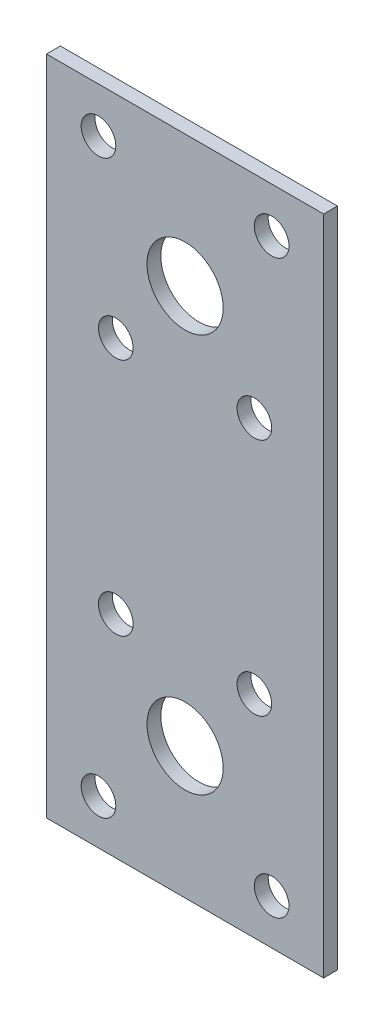
ISO-10303-21;
HEADER;
FILE_DESCRIPTION(('STEP AP214'),'2;1');
FILE_NAME('part.step','',(''),(''),'','','');
FILE_SCHEMA(('AUTOMOTIVE_DESIGN { 1 0 10303 214 1 1 1 1 }'));
ENDSEC;
DATA;
#1=APPLICATION_CONTEXT('core data for automotive mechanical design processes');
#2=APPLICATION_PROTOCOL_DEFINITION('international standard','automotive_design',2000,#1);
#3=PRODUCT_CONTEXT('',#1,'mechanical');
#4=PRODUCT('Part','Part','',(#3));
#5=PRODUCT_RELATED_PRODUCT_CATEGORY('part','',(#4));
#6=PRODUCT_DEFINITION_FORMATION('','',#4);
#7=PRODUCT_DEFINITION_CONTEXT('part definition',#1,'design');
#8=PRODUCT_DEFINITION('design','',#6,#7);
#9=PRODUCT_DEFINITION_SHAPE('','',#8);
#10=(LENGTH_UNIT() NAMED_UNIT(*) SI_UNIT(.MILLI.,.METRE.));
#11=(NAMED_UNIT(*) PLANE_ANGLE_UNIT() SI_UNIT($,.RADIAN.));
#12=(NAMED_UNIT(*) SI_UNIT($,.STERADIAN.) SOLID_ANGLE_UNIT());
#13=UNCERTAINTY_MEASURE_WITH_UNIT(LENGTH_MEASURE(1.E-05),#10,'distance_accuracy_value','');
#14=(GEOMETRIC_REPRESENTATION_CONTEXT(3) GLOBAL_UNCERTAINTY_ASSIGNED_CONTEXT((#13)) GLOBAL_UNIT_ASSIGNED_CONTEXT((#10,
#11,#12)) REPRESENTATION_CONTEXT('',''));
#15=CARTESIAN_POINT('',(0.,0.,0.));
#16=DIRECTION('',(0.,0.,1.));
#17=DIRECTION('',(1.,0.,0.));
#18=AXIS2_PLACEMENT_3D('',#15,#16,#17);
#19=CARTESIAN_POINT('',(0.,0.108407346410227,-1.6084073464102));
#20=DIRECTION('',(0.,0.,-1.));
#21=DIRECTION('',(0.,1.,0.));
#22=AXIS2_PLACEMENT_3D('',#19,#20,#21);
#23=PLANE('',#22);
#24=DIRECTION('',(0.,-1.,0.));
#25=VECTOR('',#24,1.);
#26=CARTESIAN_POINT('',(-20.,-47.6415926535898,-1.60840734641036));
#27=LINE('',#26,#25);
#28=CARTESIAN_POINT('',(-20.,47.8584073464102,-1.60840734641003));
#29=VERTEX_POINT('',#28);
#30=CARTESIAN_POINT('',(-20.,-47.6415926535898,-1.60840734641036));
#31=VERTEX_POINT('',#30);
#32=EDGE_CURVE('E68',#29,#31,#27,.T.);
#33=ORIENTED_EDGE('',*,*,#32,.F.);
#34=DIRECTION('',(-1.,0.,0.));
#35=VECTOR('',#34,1.);
#36=CARTESIAN_POINT('',(-20.,47.8584073464102,-1.60840734641003));
#37=LINE('',#36,#35);
#38=CARTESIAN_POINT('',(20.,47.8584073464102,-1.60840734641003));
#39=VERTEX_POINT('',#38);
#40=EDGE_CURVE('E121',#39,#29,#37,.T.);
#41=ORIENTED_EDGE('',*,*,#40,.F.);
#42=DIRECTION('',(0.,1.,0.));
#43=VECTOR('',#42,1.);
#44=CARTESIAN_POINT('',(20.,-47.6415926535898,-1.60840734641036));
#45=LINE('',#44,#43);
#46=CARTESIAN_POINT('',(20.,-47.6415926535898,-1.60840734641036));
#47=VERTEX_POINT('',#46);
#48=EDGE_CURVE('E97',#47,#39,#45,.T.);
#49=ORIENTED_EDGE('',*,*,#48,.F.);
#50=DIRECTION('',(1.,0.,0.));
#51=VECTOR('',#50,1.);
#52=CARTESIAN_POINT('',(-20.,-47.6415926535898,-1.60840734641036));
#53=LINE('',#52,#51);
#54=EDGE_CURVE('E61',#31,#47,#53,.T.);
#55=ORIENTED_EDGE('',*,*,#54,.F.);
#56=EDGE_LOOP('',(#33,#41,#49,#55));
#57=FACE_BOUND('',#56,.T.);
#58=CARTESIAN_POINT('',(-12.5,-41.1415926535898,-1.60840734641034));
#59=DIRECTION('',(0.,0.,1.));
#60=DIRECTION('',(0.,-1.,0.));
#61=AXIS2_PLACEMENT_3D('',#58,#59,#60);
#62=CIRCLE('',#61,2.5);
#63=CARTESIAN_POINT('',(-12.5,-43.6415926535898,-1.60840734641035));
#64=VERTEX_POINT('',#63);
#65=EDGE_CURVE('E133',#64,#64,#62,.T.);
#66=ORIENTED_EDGE('',*,*,#65,.T.);
#67=EDGE_LOOP('',(#66));
#68=FACE_BOUND('',#67,.T.);
#69=CARTESIAN_POINT('',(12.5,-41.1415926535898,-1.60840734641034));
#70=DIRECTION('',(0.,0.,1.));
#71=DIRECTION('',(0.,-1.,0.));
#72=AXIS2_PLACEMENT_3D('',#69,#70,#71);
#73=CIRCLE('',#72,2.5);
#74=CARTESIAN_POINT('',(12.5,-43.6415926535898,-1.60840734641035));
#75=VERTEX_POINT('',#74);
#76=EDGE_CURVE('E196',#75,#75,#73,.T.);
#77=ORIENTED_EDGE('',*,*,#76,.T.);
#78=EDGE_LOOP('',(#77));
#79=FACE_BOUND('',#78,.T.);
#80=CARTESIAN_POINT('',(10.,-17.1415926535898,-1.60840734641026));
#81=DIRECTION('',(0.,0.,1.));
#82=DIRECTION('',(0.,-1.,0.));
#83=AXIS2_PLACEMENT_3D('',#80,#81,#82);
#84=CIRCLE('',#83,2.5);
#85=CARTESIAN_POINT('',(10.,-19.6415926535898,-1.60840734641026));
#86=VERTEX_POINT('',#85);
#87=EDGE_CURVE('E188',#86,#86,#84,.T.);
#88=ORIENTED_EDGE('',*,*,#87,.T.);
#89=EDGE_LOOP('',(#88));
#90=FACE_BOUND('',#89,.T.);
#91=CARTESIAN_POINT('',(0.,-28.6415926535898,-1.6084073464103));
#92=DIRECTION('',(0.,0.,1.));
#93=DIRECTION('',(0.,-1.,0.));
#94=AXIS2_PLACEMENT_3D('',#91,#92,#93);
#95=CIRCLE('',#94,5.5);
#96=CARTESIAN_POINT('',(0.,-34.1415926535898,-1.60840734641032));
#97=VERTEX_POINT('',#96);
#98=EDGE_CURVE('E180',#97,#97,#95,.T.);
#99=ORIENTED_EDGE('',*,*,#98,.T.);
#100=EDGE_LOOP('',(#99));
#101=FACE_BOUND('',#100,.T.);
#102=CARTESIAN_POINT('',(-10.,-17.1415926535898,-1.60840734641026));
#103=DIRECTION('',(0.,0.,1.));
#104=DIRECTION('',(0.,-1.,0.));
#105=AXIS2_PLACEMENT_3D('',#102,#103,#104);
#106=CIRCLE('',#105,2.5);
#107=CARTESIAN_POINT('',(-10.,-19.6415926535898,-1.60840734641026));
#108=VERTEX_POINT('',#107);
#109=EDGE_CURVE('E207',#108,#108,#106,.T.);
#110=ORIENTED_EDGE('',*,*,#109,.T.);
#111=EDGE_LOOP('',(#110));
#112=FACE_BOUND('',#111,.T.);
#113=CARTESIAN_POINT('',(10.,17.3584073464102,-1.60840734641019));
#114=DIRECTION('',(0.,0.,1.));
#115=DIRECTION('',(1.,0.,0.));
#116=AXIS2_PLACEMENT_3D('',#113,#114,#115);
#117=CIRCLE('',#116,2.5);
#118=CARTESIAN_POINT('',(12.5,17.3584073464102,-1.60840734641019));
#119=VERTEX_POINT('',#118);
#120=EDGE_CURVE('E150',#119,#119,#117,.T.);
#121=ORIENTED_EDGE('',*,*,#120,.T.);
#122=EDGE_LOOP('',(#121));
#123=FACE_BOUND('',#122,.T.);
#124=CARTESIAN_POINT('',(-10.,17.3584073464102,-1.60840734641019));
#125=DIRECTION('',(0.,0.,1.));
#126=DIRECTION('',(1.,0.,0.));
#127=AXIS2_PLACEMENT_3D('',#124,#125,#126);
#128=CIRCLE('',#127,2.5);
#129=CARTESIAN_POINT('',(-7.5,17.3584073464102,-1.60840734641019));
#130=VERTEX_POINT('',#129);
#131=EDGE_CURVE('E146',#130,#130,#128,.T.);
#132=ORIENTED_EDGE('',*,*,#131,.T.);
#133=EDGE_LOOP('',(#132));
#134=FACE_BOUND('',#133,.T.);
#135=CARTESIAN_POINT('',(-12.5,41.3584073464102,-1.60840734641019));
#136=DIRECTION('',(0.,0.,1.));
#137=DIRECTION('',(1.,0.,0.));
#138=AXIS2_PLACEMENT_3D('',#135,#136,#137);
#139=CIRCLE('',#138,2.5);
#140=CARTESIAN_POINT('',(-10.,41.3584073464102,-1.60840734641019));
#141=VERTEX_POINT('',#140);
#142=EDGE_CURVE('E142',#141,#141,#139,.T.);
#143=ORIENTED_EDGE('',*,*,#142,.T.);
#144=EDGE_LOOP('',(#143));
#145=FACE_BOUND('',#144,.T.);
#146=CARTESIAN_POINT('',(12.5,41.3584073464102,-1.60840734641019));
#147=DIRECTION('',(0.,0.,1.));
#148=DIRECTION('',(1.,0.,0.));
#149=AXIS2_PLACEMENT_3D('',#146,#147,#148);
#150=CIRCLE('',#149,2.5);
#151=CARTESIAN_POINT('',(15.,41.3584073464102,-1.60840734641019));
#152=VERTEX_POINT('',#151);
#153=EDGE_CURVE('E136',#152,#152,#150,.T.);
#154=ORIENTED_EDGE('',*,*,#153,.T.);
#155=EDGE_LOOP('',(#154));
#156=FACE_BOUND('',#155,.T.);
#157=CARTESIAN_POINT('',(0.,28.8584073464102,-1.60840734641019));
#158=DIRECTION('',(0.,0.,1.));
#159=DIRECTION('',(1.,0.,0.));
#160=AXIS2_PLACEMENT_3D('',#157,#158,#159);
#161=CIRCLE('',#160,5.5);
#162=CARTESIAN_POINT('',(5.5,28.8584073464102,-1.60840734641019));
#163=VERTEX_POINT('',#162);
#164=EDGE_CURVE('E129',#163,#163,#161,.T.);
#165=ORIENTED_EDGE('',*,*,#164,.T.);
#166=EDGE_LOOP('',(#165));
#167=FACE_BOUND('',#166,.T.);
#168=ADVANCED_FACE('F57',(#57,#68,#79,#90,#101,#112,#123,#134,#145,#156,#167),#23,.T.);
#169=CARTESIAN_POINT('',(0.,0.108407346410225,0.391592653589806));
#170=DIRECTION('',(0.,0.,-1.));
#171=DIRECTION('',(0.,1.,0.));
#172=AXIS2_PLACEMENT_3D('',#169,#170,#171);
#173=PLANE('',#172);
#174=DIRECTION('',(0.,1.,0.));
#175=VECTOR('',#174,1.);
#176=CARTESIAN_POINT('',(20.,-47.6415926535898,0.391592653589637));
#177=LINE('',#176,#175);
#178=CARTESIAN_POINT('',(20.,-47.6415926535898,0.391592653589637));
#179=VERTEX_POINT('',#178);
#180=CARTESIAN_POINT('',(20.,47.8584073464102,0.391592653589973));
#181=VERTEX_POINT('',#180);
#182=EDGE_CURVE('E126',#179,#181,#177,.T.);
#183=ORIENTED_EDGE('',*,*,#182,.T.);
#184=DIRECTION('',(-1.,0.,0.));
#185=VECTOR('',#184,1.);
#186=CARTESIAN_POINT('',(-20.,47.8584073464102,0.391592653589973));
#187=LINE('',#186,#185);
#188=CARTESIAN_POINT('',(-20.,47.8584073464102,0.391592653589973));
#189=VERTEX_POINT('',#188);
#190=EDGE_CURVE('E120',#181,#189,#187,.T.);
#191=ORIENTED_EDGE('',*,*,#190,.T.);
#192=DIRECTION('',(0.,-1.,0.));
#193=VECTOR('',#192,1.);
#194=CARTESIAN_POINT('',(-20.,-47.6415926535898,0.391592653589637));
#195=LINE('',#194,#193);
#196=CARTESIAN_POINT('',(-20.,-47.6415926535898,0.391592653589637));
#197=VERTEX_POINT('',#196);
#198=EDGE_CURVE('E106',#189,#197,#195,.T.);
#199=ORIENTED_EDGE('',*,*,#198,.T.);
#200=DIRECTION('',(1.,0.,0.));
#201=VECTOR('',#200,1.);
#202=CARTESIAN_POINT('',(-20.,-47.6415926535898,0.391592653589637));
#203=LINE('',#202,#201);
#204=EDGE_CURVE('E115',#197,#179,#203,.T.);
#205=ORIENTED_EDGE('',*,*,#204,.T.);
#206=EDGE_LOOP('',(#183,#191,#199,#205));
#207=FACE_BOUND('',#206,.T.);
#208=CARTESIAN_POINT('',(-10.,-17.1415926535898,0.391592653589744));
#209=DIRECTION('',(0.,0.,1.));
#210=DIRECTION('',(0.,-1.,0.));
#211=AXIS2_PLACEMENT_3D('',#208,#209,#210);
#212=CIRCLE('',#211,2.5);
#213=CARTESIAN_POINT('',(-10.,-19.6415926535898,0.391592653589735));
#214=VERTEX_POINT('',#213);
#215=EDGE_CURVE('E179',#214,#214,#212,.T.);
#216=ORIENTED_EDGE('',*,*,#215,.F.);
#217=EDGE_LOOP('',(#216));
#218=FACE_BOUND('',#217,.T.);
#219=CARTESIAN_POINT('',(0.,-28.6415926535898,0.391592653589704));
#220=DIRECTION('',(0.,0.,1.));
#221=DIRECTION('',(0.,-1.,0.));
#222=AXIS2_PLACEMENT_3D('',#219,#220,#221);
#223=CIRCLE('',#222,5.5);
#224=CARTESIAN_POINT('',(0.,-34.1415926535898,0.391592653589684));
#225=VERTEX_POINT('',#224);
#226=EDGE_CURVE('E175',#225,#225,#223,.T.);
#227=ORIENTED_EDGE('',*,*,#226,.F.);
#228=EDGE_LOOP('',(#227));
#229=FACE_BOUND('',#228,.T.);
#230=CARTESIAN_POINT('',(10.,-17.1415926535898,0.391592653589744));
#231=DIRECTION('',(0.,0.,1.));
#232=DIRECTION('',(0.,-1.,0.));
#233=AXIS2_PLACEMENT_3D('',#230,#231,#232);
#234=CIRCLE('',#233,2.5);
#235=CARTESIAN_POINT('',(10.,-19.6415926535898,0.391592653589735));
#236=VERTEX_POINT('',#235);
#237=EDGE_CURVE('E184',#236,#236,#234,.T.);
#238=ORIENTED_EDGE('',*,*,#237,.F.);
#239=EDGE_LOOP('',(#238));
#240=FACE_BOUND('',#239,.T.);
#241=CARTESIAN_POINT('',(12.5,-41.1415926535898,0.39159265358966));
#242=DIRECTION('',(0.,0.,1.));
#243=DIRECTION('',(0.,-1.,0.));
#244=AXIS2_PLACEMENT_3D('',#241,#242,#243);
#245=CIRCLE('',#244,2.5);
#246=CARTESIAN_POINT('',(12.5,-43.6415926535898,0.391592653589651));
#247=VERTEX_POINT('',#246);
#248=EDGE_CURVE('E192',#247,#247,#245,.T.);
#249=ORIENTED_EDGE('',*,*,#248,.F.);
#250=EDGE_LOOP('',(#249));
#251=FACE_BOUND('',#250,.T.);
#252=CARTESIAN_POINT('',(-12.5,-41.1415926535898,0.39159265358966));
#253=DIRECTION('',(0.,0.,1.));
#254=DIRECTION('',(0.,-1.,0.));
#255=AXIS2_PLACEMENT_3D('',#252,#253,#254);
#256=CIRCLE('',#255,2.5);
#257=CARTESIAN_POINT('',(-12.5,-43.6415926535898,0.391592653589651));
#258=VERTEX_POINT('',#257);
#259=EDGE_CURVE('E200',#258,#258,#256,.T.);
#260=ORIENTED_EDGE('',*,*,#259,.F.);
#261=EDGE_LOOP('',(#260));
#262=FACE_BOUND('',#261,.T.);
#263=CARTESIAN_POINT('',(0.,28.8584073464102,0.391592653589806));
#264=DIRECTION('',(0.,0.,1.));
#265=DIRECTION('',(1.,0.,0.));
#266=AXIS2_PLACEMENT_3D('',#263,#264,#265);
#267=CIRCLE('',#266,5.5);
#268=CARTESIAN_POINT('',(5.5,28.8584073464102,0.391592653589806));
#269=VERTEX_POINT('',#268);
#270=EDGE_CURVE('E123',#269,#269,#267,.T.);
#271=ORIENTED_EDGE('',*,*,#270,.F.);
#272=EDGE_LOOP('',(#271));
#273=FACE_BOUND('',#272,.T.);
#274=CARTESIAN_POINT('',(12.5,41.3584073464102,0.391592653589806));
#275=DIRECTION('',(0.,0.,1.));
#276=DIRECTION('',(1.,0.,0.));
#277=AXIS2_PLACEMENT_3D('',#274,#275,#276);
#278=CIRCLE('',#277,2.5);
#279=CARTESIAN_POINT('',(15.,41.3584073464102,0.391592653589806));
#280=VERTEX_POINT('',#279);
#281=EDGE_CURVE('E166',#280,#280,#278,.T.);
#282=ORIENTED_EDGE('',*,*,#281,.F.);
#283=EDGE_LOOP('',(#282));
#284=FACE_BOUND('',#283,.T.);
#285=CARTESIAN_POINT('',(-12.5,41.3584073464102,0.391592653589806));
#286=DIRECTION('',(0.,0.,1.));
#287=DIRECTION('',(1.,0.,0.));
#288=AXIS2_PLACEMENT_3D('',#285,#286,#287);
#289=CIRCLE('',#288,2.5);
#290=CARTESIAN_POINT('',(-10.,41.3584073464102,0.391592653589806));
#291=VERTEX_POINT('',#290);
#292=EDGE_CURVE('E162',#291,#291,#289,.T.);
#293=ORIENTED_EDGE('',*,*,#292,.F.);
#294=EDGE_LOOP('',(#293));
#295=FACE_BOUND('',#294,.T.);
#296=CARTESIAN_POINT('',(-10.,17.3584073464102,0.391592653589806));
#297=DIRECTION('',(0.,0.,1.));
#298=DIRECTION('',(1.,0.,0.));
#299=AXIS2_PLACEMENT_3D('',#296,#297,#298);
#300=CIRCLE('',#299,2.5);
#301=CARTESIAN_POINT('',(-7.5,17.3584073464102,0.391592653589806));
#302=VERTEX_POINT('',#301);
#303=EDGE_CURVE('E158',#302,#302,#300,.T.);
#304=ORIENTED_EDGE('',*,*,#303,.F.);
#305=EDGE_LOOP('',(#304));
#306=FACE_BOUND('',#305,.T.);
#307=CARTESIAN_POINT('',(10.,17.3584073464102,0.391592653589806));
#308=DIRECTION('',(0.,0.,1.));
#309=DIRECTION('',(1.,0.,0.));
#310=AXIS2_PLACEMENT_3D('',#307,#308,#309);
#311=CIRCLE('',#310,2.5);
#312=CARTESIAN_POINT('',(12.5,17.3584073464102,0.391592653589806));
#313=VERTEX_POINT('',#312);
#314=EDGE_CURVE('E154',#313,#313,#311,.T.);
#315=ORIENTED_EDGE('',*,*,#314,.F.);
#316=EDGE_LOOP('',(#315));
#317=FACE_BOUND('',#316,.T.);
#318=ADVANCED_FACE('F59',(#207,#218,#229,#240,#251,#262,#273,#284,#295,#306,#317),#173,.F.);
#319=CARTESIAN_POINT('',(-20.,-47.6415926535898,-1.60840734641036));
#320=DIRECTION('',(0.,-1.,0.));
#321=DIRECTION('',(1.,0.,0.));
#322=AXIS2_PLACEMENT_3D('',#319,#320,#321);
#323=PLANE('',#322);
#324=ORIENTED_EDGE('',*,*,#204,.F.);
#325=DIRECTION('',(0.,0.,1.));
#326=VECTOR('',#325,1.);
#327=CARTESIAN_POINT('',(-20.,-47.6415926535898,-1.60840734641036));
#328=LINE('',#327,#326);
#329=EDGE_CURVE('E13',#31,#197,#328,.T.);
#330=ORIENTED_EDGE('',*,*,#329,.F.);
#331=ORIENTED_EDGE('',*,*,#54,.T.);
#332=DIRECTION('',(0.,0.,1.));
#333=VECTOR('',#332,1.);
#334=CARTESIAN_POINT('',(20.,-47.6415926535898,-1.60840734641036));
#335=LINE('',#334,#333);
#336=EDGE_CURVE('E88',#47,#179,#335,.T.);
#337=ORIENTED_EDGE('',*,*,#336,.T.);
#338=EDGE_LOOP('',(#324,#330,#331,#337));
#339=FACE_BOUND('',#338,.T.);
#340=ADVANCED_FACE('F223',(#339),#323,.T.);
#341=CARTESIAN_POINT('',(20.,-47.6415926535898,-1.60840734641036));
#342=DIRECTION('',(1.,0.,0.));
#343=DIRECTION('',(0.,1.,0.));
#344=AXIS2_PLACEMENT_3D('',#341,#342,#343);
#345=PLANE('',#344);
#346=ORIENTED_EDGE('',*,*,#48,.T.);
#347=DIRECTION('',(0.,0.,1.));
#348=VECTOR('',#347,1.);
#349=CARTESIAN_POINT('',(20.,47.8584073464102,-1.60840734641003));
#350=LINE('',#349,#348);
#351=EDGE_CURVE('E128',#39,#181,#350,.T.);
#352=ORIENTED_EDGE('',*,*,#351,.T.);
#353=ORIENTED_EDGE('',*,*,#182,.F.);
#354=ORIENTED_EDGE('',*,*,#336,.F.);
#355=EDGE_LOOP('',(#346,#352,#353,#354));
#356=FACE_BOUND('',#355,.T.);
#357=ADVANCED_FACE('F298',(#356),#345,.T.);
#358=CARTESIAN_POINT('',(-20.,-47.6415926535898,-1.60840734641036));
#359=DIRECTION('',(-1.,0.,0.));
#360=DIRECTION('',(0.,-1.,0.));
#361=AXIS2_PLACEMENT_3D('',#358,#359,#360);
#362=PLANE('',#361);
#363=ORIENTED_EDGE('',*,*,#198,.F.);
#364=DIRECTION('',(0.,0.,1.));
#365=VECTOR('',#364,1.);
#366=CARTESIAN_POINT('',(-20.,47.8584073464102,-1.60840734641003));
#367=LINE('',#366,#365);
#368=EDGE_CURVE('E109',#29,#189,#367,.T.);
#369=ORIENTED_EDGE('',*,*,#368,.F.);
#370=ORIENTED_EDGE('',*,*,#32,.T.);
#371=ORIENTED_EDGE('',*,*,#329,.T.);
#372=EDGE_LOOP('',(#363,#369,#370,#371));
#373=FACE_BOUND('',#372,.T.);
#374=ADVANCED_FACE('F108',(#373),#362,.T.);
#375=CARTESIAN_POINT('',(-10.,-17.1415926535898,-1.60840734641026));
#376=DIRECTION('',(0.,0.,1.));
#377=DIRECTION('',(0.,-1.,0.));
#378=AXIS2_PLACEMENT_3D('',#375,#376,#377);
#379=CYLINDRICAL_SURFACE('',#378,2.5);
#380=ORIENTED_EDGE('',*,*,#109,.F.);
#381=EDGE_LOOP('',(#380));
#382=FACE_BOUND('',#381,.T.);
#383=ORIENTED_EDGE('',*,*,#215,.T.);
#384=EDGE_LOOP('',(#383));
#385=FACE_BOUND('',#384,.T.);
#386=ADVANCED_FACE('F281',(#382,#385),#379,.F.);
#387=CARTESIAN_POINT('',(0.,-28.6415926535898,-1.6084073464103));
#388=DIRECTION('',(0.,0.,1.));
#389=DIRECTION('',(0.,-1.,0.));
#390=AXIS2_PLACEMENT_3D('',#387,#388,#389);
#391=CYLINDRICAL_SURFACE('',#390,5.5);
#392=ORIENTED_EDGE('',*,*,#98,.F.);
#393=EDGE_LOOP('',(#392));
#394=FACE_BOUND('',#393,.T.);
#395=ORIENTED_EDGE('',*,*,#226,.T.);
#396=EDGE_LOOP('',(#395));
#397=FACE_BOUND('',#396,.T.);
#398=ADVANCED_FACE('F277',(#394,#397),#391,.F.);
#399=CARTESIAN_POINT('',(10.,-17.1415926535898,-1.60840734641026));
#400=DIRECTION('',(0.,0.,1.));
#401=DIRECTION('',(0.,-1.,0.));
#402=AXIS2_PLACEMENT_3D('',#399,#400,#401);
#403=CYLINDRICAL_SURFACE('',#402,2.5);
#404=ORIENTED_EDGE('',*,*,#87,.F.);
#405=EDGE_LOOP('',(#404));
#406=FACE_BOUND('',#405,.T.);
#407=ORIENTED_EDGE('',*,*,#237,.T.);
#408=EDGE_LOOP('',(#407));
#409=FACE_BOUND('',#408,.T.);
#410=ADVANCED_FACE('F280',(#406,#409),#403,.F.);
#411=CARTESIAN_POINT('',(12.5,-41.1415926535898,-1.60840734641034));
#412=DIRECTION('',(0.,0.,1.));
#413=DIRECTION('',(0.,-1.,0.));
#414=AXIS2_PLACEMENT_3D('',#411,#412,#413);
#415=CYLINDRICAL_SURFACE('',#414,2.5);
#416=ORIENTED_EDGE('',*,*,#76,.F.);
#417=EDGE_LOOP('',(#416));
#418=FACE_BOUND('',#417,.T.);
#419=ORIENTED_EDGE('',*,*,#248,.T.);
#420=EDGE_LOOP('',(#419));
#421=FACE_BOUND('',#420,.T.);
#422=ADVANCED_FACE('F285',(#418,#421),#415,.F.);
#423=CARTESIAN_POINT('',(-12.5,-41.1415926535898,-1.60840734641034));
#424=DIRECTION('',(0.,0.,1.));
#425=DIRECTION('',(0.,-1.,0.));
#426=AXIS2_PLACEMENT_3D('',#423,#424,#425);
#427=CYLINDRICAL_SURFACE('',#426,2.5);
#428=ORIENTED_EDGE('',*,*,#65,.F.);
#429=EDGE_LOOP('',(#428));
#430=FACE_BOUND('',#429,.T.);
#431=ORIENTED_EDGE('',*,*,#259,.T.);
#432=EDGE_LOOP('',(#431));
#433=FACE_BOUND('',#432,.T.);
#434=ADVANCED_FACE('F289',(#430,#433),#427,.F.);
#435=CARTESIAN_POINT('',(-20.,47.8584073464102,-1.60840734641003));
#436=DIRECTION('',(0.,1.,0.));
#437=DIRECTION('',(-1.,0.,0.));
#438=AXIS2_PLACEMENT_3D('',#435,#436,#437);
#439=PLANE('',#438);
#440=ORIENTED_EDGE('',*,*,#190,.F.);
#441=ORIENTED_EDGE('',*,*,#351,.F.);
#442=ORIENTED_EDGE('',*,*,#40,.T.);
#443=ORIENTED_EDGE('',*,*,#368,.T.);
#444=EDGE_LOOP('',(#440,#441,#442,#443));
#445=FACE_BOUND('',#444,.T.);
#446=ADVANCED_FACE('F119',(#445),#439,.T.);
#447=CARTESIAN_POINT('',(0.,28.8584073464102,-1.60840734641019));
#448=DIRECTION('',(0.,0.,1.));
#449=DIRECTION('',(1.,0.,0.));
#450=AXIS2_PLACEMENT_3D('',#447,#448,#449);
#451=CYLINDRICAL_SURFACE('',#450,5.5);
#452=ORIENTED_EDGE('',*,*,#164,.F.);
#453=EDGE_LOOP('',(#452));
#454=FACE_BOUND('',#453,.T.);
#455=ORIENTED_EDGE('',*,*,#270,.T.);
#456=EDGE_LOOP('',(#455));
#457=FACE_BOUND('',#456,.T.);
#458=ADVANCED_FACE('F247',(#454,#457),#451,.F.);
#459=CARTESIAN_POINT('',(12.5,41.3584073464102,-1.60840734641019));
#460=DIRECTION('',(0.,0.,1.));
#461=DIRECTION('',(1.,0.,0.));
#462=AXIS2_PLACEMENT_3D('',#459,#460,#461);
#463=CYLINDRICAL_SURFACE('',#462,2.5);
#464=ORIENTED_EDGE('',*,*,#153,.F.);
#465=EDGE_LOOP('',(#464));
#466=FACE_BOUND('',#465,.T.);
#467=ORIENTED_EDGE('',*,*,#281,.T.);
#468=EDGE_LOOP('',(#467));
#469=FACE_BOUND('',#468,.T.);
#470=ADVANCED_FACE('F250',(#466,#469),#463,.F.);
#471=CARTESIAN_POINT('',(-12.5,41.3584073464102,-1.60840734641019));
#472=DIRECTION('',(0.,0.,1.));
#473=DIRECTION('',(1.,0.,0.));
#474=AXIS2_PLACEMENT_3D('',#471,#472,#473);
#475=CYLINDRICAL_SURFACE('',#474,2.5);
#476=ORIENTED_EDGE('',*,*,#142,.F.);
#477=EDGE_LOOP('',(#476));
#478=FACE_BOUND('',#477,.T.);
#479=ORIENTED_EDGE('',*,*,#292,.T.);
#480=EDGE_LOOP('',(#479));
#481=FACE_BOUND('',#480,.T.);
#482=ADVANCED_FACE('F272',(#478,#481),#475,.F.);
#483=CARTESIAN_POINT('',(-10.,17.3584073464102,-1.60840734641019));
#484=DIRECTION('',(0.,0.,1.));
#485=DIRECTION('',(1.,0.,0.));
#486=AXIS2_PLACEMENT_3D('',#483,#484,#485);
#487=CYLINDRICAL_SURFACE('',#486,2.5);
#488=ORIENTED_EDGE('',*,*,#131,.F.);
#489=EDGE_LOOP('',(#488));
#490=FACE_BOUND('',#489,.T.);
#491=ORIENTED_EDGE('',*,*,#303,.T.);
#492=EDGE_LOOP('',(#491));
#493=FACE_BOUND('',#492,.T.);
#494=ADVANCED_FACE('F266',(#490,#493),#487,.F.);
#495=CARTESIAN_POINT('',(10.,17.3584073464102,-1.60840734641019));
#496=DIRECTION('',(0.,0.,1.));
#497=DIRECTION('',(1.,0.,0.));
#498=AXIS2_PLACEMENT_3D('',#495,#496,#497);
#499=CYLINDRICAL_SURFACE('',#498,2.5);
#500=ORIENTED_EDGE('',*,*,#120,.F.);
#501=EDGE_LOOP('',(#500));
#502=FACE_BOUND('',#501,.T.);
#503=ORIENTED_EDGE('',*,*,#314,.T.);
#504=EDGE_LOOP('',(#503));
#505=FACE_BOUND('',#504,.T.);
#506=ADVANCED_FACE('F264',(#502,#505),#499,.F.);
#507=CLOSED_SHELL('',(#168,#318,#340,#357,#374,#386,#398,#410,#422,#434,#446,#458,#470,#482,
#494,#506));
#508=MANIFOLD_SOLID_BREP('B2',#507);
#509=ADVANCED_BREP_SHAPE_REPRESENTATION('',(#18,#508),#14);
#510=SHAPE_DEFINITION_REPRESENTATION(#9,#509);
ENDSEC;
END-ISO-10303-21;
